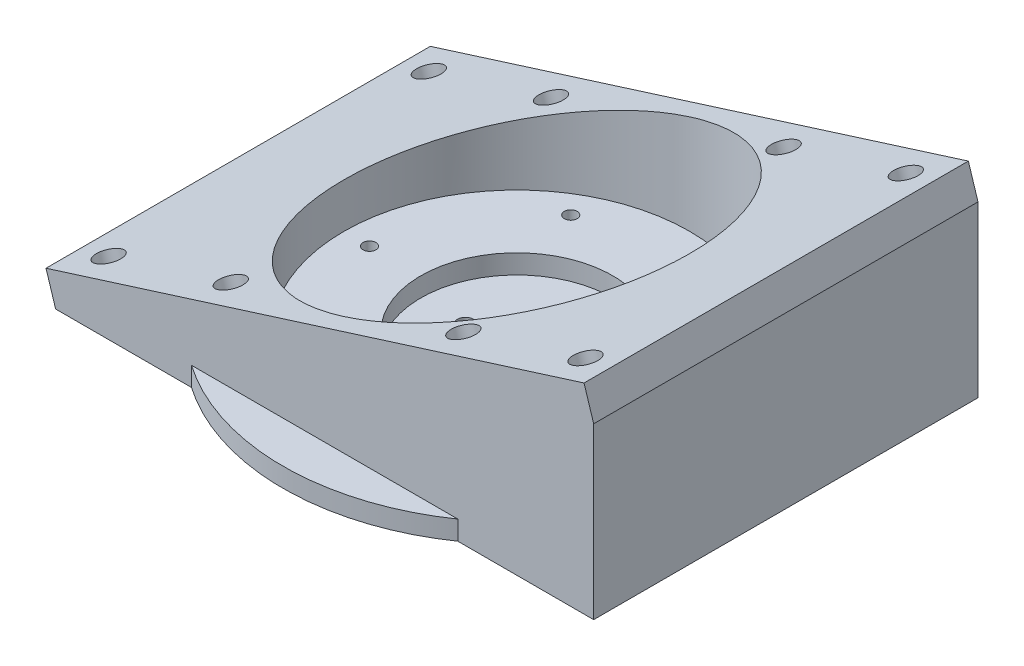
ISO-10303-21;
HEADER;
FILE_DESCRIPTION(('STEP AP214'),'2;1');
FILE_NAME('part.step','',(''),(''),'','','');
FILE_SCHEMA(('AUTOMOTIVE_DESIGN { 1 0 10303 214 1 1 1 1 }'));
ENDSEC;
DATA;
#1=APPLICATION_CONTEXT('core data for automotive mechanical design processes');
#2=APPLICATION_PROTOCOL_DEFINITION('international standard','automotive_design',2000,#1);
#3=PRODUCT_CONTEXT('',#1,'mechanical');
#4=PRODUCT('Part','Part','',(#3));
#5=PRODUCT_RELATED_PRODUCT_CATEGORY('part','',(#4));
#6=PRODUCT_DEFINITION_FORMATION('','',#4);
#7=PRODUCT_DEFINITION_CONTEXT('part definition',#1,'design');
#8=PRODUCT_DEFINITION('design','',#6,#7);
#9=PRODUCT_DEFINITION_SHAPE('','',#8);
#10=(LENGTH_UNIT() NAMED_UNIT(*) SI_UNIT(.MILLI.,.METRE.));
#11=(NAMED_UNIT(*) PLANE_ANGLE_UNIT() SI_UNIT($,.RADIAN.));
#12=(NAMED_UNIT(*) SI_UNIT($,.STERADIAN.) SOLID_ANGLE_UNIT());
#13=UNCERTAINTY_MEASURE_WITH_UNIT(LENGTH_MEASURE(1.E-05),#10,'distance_accuracy_value','');
#14=(GEOMETRIC_REPRESENTATION_CONTEXT(3) GLOBAL_UNCERTAINTY_ASSIGNED_CONTEXT((#13)) GLOBAL_UNIT_ASSIGNED_CONTEXT((#10,
#11,#12)) REPRESENTATION_CONTEXT('',''));
#15=CARTESIAN_POINT('',(0.,0.,0.));
#16=DIRECTION('',(0.,0.,1.));
#17=DIRECTION('',(1.,0.,0.));
#18=AXIS2_PLACEMENT_3D('',#15,#16,#17);
#19=CARTESIAN_POINT('',(-25.0823798627002,-10.9576659038902,30.));
#20=DIRECTION('',(0.,1.,0.));
#21=DIRECTION('',(0.,0.,1.));
#22=AXIS2_PLACEMENT_3D('',#19,#20,#21);
#23=CYLINDRICAL_SURFACE('',#22,6.);
#24=CARTESIAN_POINT('',(-25.0823798627002,-10.9576659038902,30.));
#25=DIRECTION('',(0.,1.,0.));
#26=DIRECTION('',(0.,0.,1.));
#27=AXIS2_PLACEMENT_3D('',#24,#25,#26);
#28=CIRCLE('',#27,6.);
#29=CARTESIAN_POINT('',(-25.0823798627002,-10.9576659038902,36.));
#30=VERTEX_POINT('',#29);
#31=EDGE_CURVE('E423',#30,#30,#28,.T.);
#32=ORIENTED_EDGE('',*,*,#31,.F.);
#33=EDGE_LOOP('',(#32));
#34=FACE_BOUND('',#33,.T.);
#35=CARTESIAN_POINT('',(-25.0823798627002,-7.95766590389017,30.));
#36=DIRECTION('',(0.,1.,0.));
#37=DIRECTION('',(0.,0.,1.));
#38=AXIS2_PLACEMENT_3D('',#35,#36,#37);
#39=CIRCLE('',#38,6.);
#40=CARTESIAN_POINT('',(-25.0823798627002,-7.95766590389017,36.));
#41=VERTEX_POINT('',#40);
#42=EDGE_CURVE('E54',#41,#41,#39,.F.);
#43=ORIENTED_EDGE('',*,*,#42,.F.);
#44=EDGE_LOOP('',(#43));
#45=FACE_BOUND('',#44,.T.);
#46=ADVANCED_FACE('F50',(#34,#45),#23,.F.);
#47=CARTESIAN_POINT('',(-25.0823798627002,42.0423340961098,30.));
#48=DIRECTION('',(0.,-1.,0.));
#49=DIRECTION('',(0.,0.,-1.));
#50=AXIS2_PLACEMENT_3D('',#47,#48,#49);
#51=CYLINDRICAL_SURFACE('',#50,27.);
#52=CARTESIAN_POINT('',(-25.0823798627002,10.5275288547312,30.));
#53=DIRECTION('',(-0.300705799504274,0.953716950748227,0.));
#54=DIRECTION('',(-0.953716950748227,-0.300705799504274,0.));
#55=AXIS2_PLACEMENT_3D('',#52,#53,#54);
#56=ELLIPSE('',#55,28.3102863788019,27.);
#57=CARTESIAN_POINT('',(-52.0823798627002,2.01446155499865,30.));
#58=VERTEX_POINT('',#57);
#59=EDGE_CURVE('E151',#58,#58,#56,.T.);
#60=ORIENTED_EDGE('',*,*,#59,.T.);
#61=EDGE_LOOP('',(#60));
#62=FACE_BOUND('',#61,.T.);
#63=CARTESIAN_POINT('',(-25.0823798627002,-4.95766590389017,30.));
#64=DIRECTION('',(0.,-1.,0.));
#65=DIRECTION('',(0.,0.,-1.));
#66=AXIS2_PLACEMENT_3D('',#63,#64,#65);
#67=CIRCLE('',#66,27.);
#68=CARTESIAN_POINT('',(-25.0823798627002,-4.95766590389017,3.));
#69=VERTEX_POINT('',#68);
#70=EDGE_CURVE('E185',#69,#69,#67,.F.);
#71=ORIENTED_EDGE('',*,*,#70,.F.);
#72=EDGE_LOOP('',(#71));
#73=FACE_BOUND('',#72,.T.);
#74=ADVANCED_FACE('F219',(#62,#73),#51,.F.);
#75=CARTESIAN_POINT('',(-67.0823798627002,-7.95766590389017,60.));
#76=DIRECTION('',(0.,1.,0.));
#77=DIRECTION('',(0.,0.,1.));
#78=AXIS2_PLACEMENT_3D('',#75,#76,#77);
#79=PLANE('',#78);
#80=CARTESIAN_POINT('',(-36.5823798627005,-7.95766590389017,10.081415712958));
#81=DIRECTION('',(0.,1.,0.));
#82=DIRECTION('',(0.,0.,1.));
#83=AXIS2_PLACEMENT_3D('',#80,#81,#82);
#84=CIRCLE('',#83,0.999999999999998);
#85=CARTESIAN_POINT('',(-36.5823798627005,-7.95766590389017,11.081415712958));
#86=VERTEX_POINT('',#85);
#87=EDGE_CURVE('E337',#86,#86,#84,.T.);
#88=ORIENTED_EDGE('',*,*,#87,.T.);
#89=EDGE_LOOP('',(#88));
#90=FACE_BOUND('',#89,.T.);
#91=CARTESIAN_POINT('',(-13.5823798627004,-7.95766590389017,10.0814157129578));
#92=DIRECTION('',(0.,1.,0.));
#93=DIRECTION('',(0.,0.,1.));
#94=AXIS2_PLACEMENT_3D('',#91,#92,#93);
#95=CIRCLE('',#94,0.999999999999998);
#96=CARTESIAN_POINT('',(-13.5823798627004,-7.95766590389017,11.0814157129578));
#97=VERTEX_POINT('',#96);
#98=EDGE_CURVE('E342',#97,#97,#95,.T.);
#99=ORIENTED_EDGE('',*,*,#98,.T.);
#100=EDGE_LOOP('',(#99));
#101=FACE_BOUND('',#100,.T.);
#102=CARTESIAN_POINT('',(-2.08237986270024,-7.95766590389017,30.));
#103=DIRECTION('',(0.,1.,0.));
#104=DIRECTION('',(0.,0.,1.));
#105=AXIS2_PLACEMENT_3D('',#102,#103,#104);
#106=CIRCLE('',#105,0.999999999999998);
#107=CARTESIAN_POINT('',(-2.08237986270024,-7.95766590389017,31.));
#108=VERTEX_POINT('',#107);
#109=EDGE_CURVE('E345',#108,#108,#106,.T.);
#110=ORIENTED_EDGE('',*,*,#109,.T.);
#111=EDGE_LOOP('',(#110));
#112=FACE_BOUND('',#111,.T.);
#113=CARTESIAN_POINT('',(-13.5823798627001,-7.95766590389017,49.918584287042));
#114=DIRECTION('',(0.,1.,0.));
#115=DIRECTION('',(0.,0.,1.));
#116=AXIS2_PLACEMENT_3D('',#113,#114,#115);
#117=CIRCLE('',#116,0.999999999999998);
#118=CARTESIAN_POINT('',(-13.5823798627001,-7.95766590389017,50.918584287042));
#119=VERTEX_POINT('',#118);
#120=EDGE_CURVE('E348',#119,#119,#117,.T.);
#121=ORIENTED_EDGE('',*,*,#120,.T.);
#122=EDGE_LOOP('',(#121));
#123=FACE_BOUND('',#122,.T.);
#124=CARTESIAN_POINT('',(-36.5823798627002,-7.95766590389017,49.9185842870421));
#125=DIRECTION('',(0.,1.,0.));
#126=DIRECTION('',(0.,0.,1.));
#127=AXIS2_PLACEMENT_3D('',#124,#125,#126);
#128=CIRCLE('',#127,0.999999999999998);
#129=CARTESIAN_POINT('',(-36.5823798627002,-7.95766590389017,50.9185842870421));
#130=VERTEX_POINT('',#129);
#131=EDGE_CURVE('E351',#130,#130,#128,.T.);
#132=ORIENTED_EDGE('',*,*,#131,.T.);
#133=EDGE_LOOP('',(#132));
#134=FACE_BOUND('',#133,.T.);
#135=CARTESIAN_POINT('',(-48.0823798627002,-7.95766590389017,30.));
#136=DIRECTION('',(0.,1.,0.));
#137=DIRECTION('',(0.,0.,1.));
#138=AXIS2_PLACEMENT_3D('',#135,#136,#137);
#139=CIRCLE('',#138,0.999999999999998);
#140=CARTESIAN_POINT('',(-48.0823798627002,-7.95766590389017,31.));
#141=VERTEX_POINT('',#140);
#142=EDGE_CURVE('E144',#141,#141,#139,.T.);
#143=ORIENTED_EDGE('',*,*,#142,.T.);
#144=EDGE_LOOP('',(#143));
#145=FACE_BOUND('',#144,.T.);
#146=CARTESIAN_POINT('',(-25.0823798627002,-7.95766590389017,30.));
#147=DIRECTION('',(0.,1.,0.));
#148=DIRECTION('',(0.,0.,1.));
#149=AXIS2_PLACEMENT_3D('',#146,#147,#148);
#150=CIRCLE('',#149,20.);
#151=CARTESIAN_POINT('',(-25.0823798627002,-7.95766590389017,50.));
#152=VERTEX_POINT('',#151);
#153=EDGE_CURVE('E410',#152,#152,#150,.T.);
#154=ORIENTED_EDGE('',*,*,#153,.T.);
#155=EDGE_LOOP('',(#154));
#156=FACE_BOUND('',#155,.T.);
#157=DIRECTION('',(1.,0.,0.));
#158=VECTOR('',#157,1.);
#159=CARTESIAN_POINT('',(-67.0823798627002,-7.95766590389017,0.));
#160=LINE('',#159,#158);
#161=CARTESIAN_POINT('',(-67.0823798627002,-7.95766590389017,0.));
#162=VERTEX_POINT('',#161);
#163=CARTESIAN_POINT('',(-45.873002748992,-7.95766590389017,0.));
#164=VERTEX_POINT('',#163);
#165=EDGE_CURVE('E177',#162,#164,#160,.T.);
#166=ORIENTED_EDGE('',*,*,#165,.T.);
#167=CARTESIAN_POINT('',(-25.0823798627002,-7.95766590389017,30.));
#168=DIRECTION('',(0.,-1.,0.));
#169=DIRECTION('',(0.,0.,-1.));
#170=AXIS2_PLACEMENT_3D('',#167,#168,#169);
#171=CIRCLE('',#170,36.5);
#172=CARTESIAN_POINT('',(-4.29175697640848,-7.95766590389017,0.));
#173=VERTEX_POINT('',#172);
#174=EDGE_CURVE('E139',#164,#173,#171,.T.);
#175=ORIENTED_EDGE('',*,*,#174,.T.);
#176=CARTESIAN_POINT('',(16.9176201372998,-7.95766590389017,0.));
#177=VERTEX_POINT('',#176);
#178=EDGE_CURVE('E172',#173,#177,#160,.T.);
#179=ORIENTED_EDGE('',*,*,#178,.T.);
#180=DIRECTION('',(0.,0.,-1.));
#181=VECTOR('',#180,1.);
#182=CARTESIAN_POINT('',(16.9176201372998,-7.95766590389017,60.));
#183=LINE('',#182,#181);
#184=CARTESIAN_POINT('',(16.9176201372998,-7.95766590389017,60.));
#185=VERTEX_POINT('',#184);
#186=EDGE_CURVE('E126',#185,#177,#183,.T.);
#187=ORIENTED_EDGE('',*,*,#186,.F.);
#188=DIRECTION('',(1.,0.,0.));
#189=VECTOR('',#188,1.);
#190=CARTESIAN_POINT('',(-67.0823798627002,-7.95766590389017,60.));
#191=LINE('',#190,#189);
#192=CARTESIAN_POINT('',(-4.29175697640845,-7.95766590389017,60.));
#193=VERTEX_POINT('',#192);
#194=EDGE_CURVE('E121',#193,#185,#191,.T.);
#195=ORIENTED_EDGE('',*,*,#194,.F.);
#196=CARTESIAN_POINT('',(-45.873002748992,-7.95766590389017,60.));
#197=VERTEX_POINT('',#196);
#198=EDGE_CURVE('E124',#193,#197,#171,.T.);
#199=ORIENTED_EDGE('',*,*,#198,.T.);
#200=CARTESIAN_POINT('',(-67.0823798627002,-7.95766590389017,60.));
#201=VERTEX_POINT('',#200);
#202=EDGE_CURVE('E128',#201,#197,#191,.T.);
#203=ORIENTED_EDGE('',*,*,#202,.F.);
#204=DIRECTION('',(0.,0.,-1.));
#205=VECTOR('',#204,1.);
#206=CARTESIAN_POINT('',(-67.0823798627002,-7.95766590389017,60.));
#207=LINE('',#206,#205);
#208=EDGE_CURVE('E183',#201,#162,#207,.T.);
#209=ORIENTED_EDGE('',*,*,#208,.T.);
#210=EDGE_LOOP('',(#166,#175,#179,#187,#195,#199,#203,#209));
#211=FACE_BOUND('',#210,.T.);
#212=ADVANCED_FACE('F52',(#90,#101,#112,#123,#134,#145,#156,#211),#79,.F.);
#213=CARTESIAN_POINT('',(16.9176201372998,-7.95766590389017,60.));
#214=DIRECTION('',(-1.,0.,0.));
#215=DIRECTION('',(0.,0.,1.));
#216=AXIS2_PLACEMENT_3D('',#213,#214,#215);
#217=PLANE('',#216);
#218=DIRECTION('',(0.,1.,0.));
#219=VECTOR('',#218,1.);
#220=CARTESIAN_POINT('',(16.9176201372998,-7.95766590389017,0.));
#221=LINE('',#220,#219);
#222=CARTESIAN_POINT('',(16.9176201372998,18.5274323619445,0.));
#223=VERTEX_POINT('',#222);
#224=EDGE_CURVE('E129',#177,#223,#221,.T.);
#225=ORIENTED_EDGE('',*,*,#224,.T.);
#226=DIRECTION('',(0.,0.,-1.));
#227=VECTOR('',#226,1.);
#228=CARTESIAN_POINT('',(16.9176201372998,18.5274323619445,60.));
#229=LINE('',#228,#227);
#230=CARTESIAN_POINT('',(16.9176201372998,18.5274323619445,60.));
#231=VERTEX_POINT('',#230);
#232=EDGE_CURVE('E176',#231,#223,#229,.T.);
#233=ORIENTED_EDGE('',*,*,#232,.F.);
#234=DIRECTION('',(0.,1.,0.));
#235=VECTOR('',#234,1.);
#236=CARTESIAN_POINT('',(16.9176201372998,-7.95766590389017,60.));
#237=LINE('',#236,#235);
#238=EDGE_CURVE('E174',#185,#231,#237,.T.);
#239=ORIENTED_EDGE('',*,*,#238,.F.);
#240=ORIENTED_EDGE('',*,*,#186,.T.);
#241=EDGE_LOOP('',(#225,#233,#239,#240));
#242=FACE_BOUND('',#241,.T.);
#243=ADVANCED_FACE('F499',(#242),#217,.F.);
#244=CARTESIAN_POINT('',(0.,0.,60.));
#245=DIRECTION('',(0.,0.,1.));
#246=DIRECTION('',(1.,0.,0.));
#247=AXIS2_PLACEMENT_3D('',#244,#245,#246);
#248=PLANE('',#247);
#249=DIRECTION('',(0.,-1.,0.));
#250=VECTOR('',#249,1.);
#251=CARTESIAN_POINT('',(-45.873002748992,-4.95766590389017,60.));
#252=LINE('',#251,#250);
#253=CARTESIAN_POINT('',(-45.873002748992,-4.95766590389017,60.));
#254=VERTEX_POINT('',#253);
#255=EDGE_CURVE('E71',#254,#197,#252,.T.);
#256=ORIENTED_EDGE('',*,*,#255,.F.);
#257=DIRECTION('',(1.,0.,0.));
#258=VECTOR('',#257,1.);
#259=CARTESIAN_POINT('',(0.,-4.95766590389017,60.));
#260=LINE('',#259,#258);
#261=CARTESIAN_POINT('',(-4.29175697640845,-4.95766590389017,60.));
#262=VERTEX_POINT('',#261);
#263=EDGE_CURVE('E66',#254,#262,#260,.T.);
#264=ORIENTED_EDGE('',*,*,#263,.T.);
#265=DIRECTION('',(0.,-1.,0.));
#266=VECTOR('',#265,1.);
#267=CARTESIAN_POINT('',(-4.29175697640845,-4.95766590389017,60.));
#268=LINE('',#267,#266);
#269=EDGE_CURVE('E131',#193,#262,#268,.F.);
#270=ORIENTED_EDGE('',*,*,#269,.F.);
#271=ORIENTED_EDGE('',*,*,#194,.T.);
#272=ORIENTED_EDGE('',*,*,#238,.T.);
#273=DIRECTION('',(0.300705799504274,-0.953716950748227,0.));
#274=VECTOR('',#273,1.);
#275=CARTESIAN_POINT('',(15.4140911397784,23.2960171156857,60.));
#276=LINE('',#275,#274);
#277=CARTESIAN_POINT('',(15.4140911397784,23.2960171156857,60.));
#278=VERTEX_POINT('',#277);
#279=EDGE_CURVE('E167',#278,#231,#276,.T.);
#280=ORIENTED_EDGE('',*,*,#279,.F.);
#281=DIRECTION('',(0.953716950748227,0.300705799504274,0.));
#282=VECTOR('',#281,1.);
#283=CARTESIAN_POINT('',(-68.5859088602216,-3.18908115014903,60.));
#284=LINE('',#283,#282);
#285=CARTESIAN_POINT('',(-68.5859088602216,-3.18908115014903,60.));
#286=VERTEX_POINT('',#285);
#287=EDGE_CURVE('E155',#286,#278,#284,.T.);
#288=ORIENTED_EDGE('',*,*,#287,.F.);
#289=DIRECTION('',(0.300705799504274,-0.953716950748227,0.));
#290=VECTOR('',#289,1.);
#291=CARTESIAN_POINT('',(-68.5859088602216,-3.18908115014903,60.));
#292=LINE('',#291,#290);
#293=EDGE_CURVE('E170',#286,#201,#292,.T.);
#294=ORIENTED_EDGE('',*,*,#293,.T.);
#295=ORIENTED_EDGE('',*,*,#202,.T.);
#296=EDGE_LOOP('',(#256,#264,#270,#271,#272,#280,#288,#294,#295));
#297=FACE_BOUND('',#296,.T.);
#298=ADVANCED_FACE('F132',(#297),#248,.T.);
#299=CARTESIAN_POINT('',(0.,0.,0.));
#300=DIRECTION('',(0.,0.,1.));
#301=DIRECTION('',(1.,0.,0.));
#302=AXIS2_PLACEMENT_3D('',#299,#300,#301);
#303=PLANE('',#302);
#304=DIRECTION('',(1.,0.,0.));
#305=VECTOR('',#304,1.);
#306=CARTESIAN_POINT('',(0.,-4.95766590389017,0.));
#307=LINE('',#306,#305);
#308=CARTESIAN_POINT('',(-45.873002748992,-4.95766590389017,0.));
#309=VERTEX_POINT('',#308);
#310=CARTESIAN_POINT('',(-4.29175697640845,-4.95766590389017,0.));
#311=VERTEX_POINT('',#310);
#312=EDGE_CURVE('E147',#309,#311,#307,.T.);
#313=ORIENTED_EDGE('',*,*,#312,.F.);
#314=DIRECTION('',(0.,-1.,0.));
#315=VECTOR('',#314,1.);
#316=CARTESIAN_POINT('',(-45.873002748992,-4.95766590389017,0.));
#317=LINE('',#316,#315);
#318=EDGE_CURVE('E13',#309,#164,#317,.T.);
#319=ORIENTED_EDGE('',*,*,#318,.T.);
#320=ORIENTED_EDGE('',*,*,#165,.F.);
#321=DIRECTION('',(0.300705799504274,-0.953716950748227,0.));
#322=VECTOR('',#321,1.);
#323=CARTESIAN_POINT('',(-68.5859088602216,-3.18908115014903,0.));
#324=LINE('',#323,#322);
#325=CARTESIAN_POINT('',(-68.5859088602216,-3.18908115014903,0.));
#326=VERTEX_POINT('',#325);
#327=EDGE_CURVE('E161',#326,#162,#324,.T.);
#328=ORIENTED_EDGE('',*,*,#327,.F.);
#329=DIRECTION('',(-0.953716950748227,-0.300705799504274,0.));
#330=VECTOR('',#329,1.);
#331=CARTESIAN_POINT('',(-68.5859088602216,-3.18908115014903,0.));
#332=LINE('',#331,#330);
#333=CARTESIAN_POINT('',(15.4140911397784,23.2960171156856,0.));
#334=VERTEX_POINT('',#333);
#335=EDGE_CURVE('E159',#334,#326,#332,.T.);
#336=ORIENTED_EDGE('',*,*,#335,.F.);
#337=DIRECTION('',(0.300705799504274,-0.953716950748227,0.));
#338=VECTOR('',#337,1.);
#339=CARTESIAN_POINT('',(15.4140911397784,23.2960171156856,0.));
#340=LINE('',#339,#338);
#341=EDGE_CURVE('E164',#334,#223,#340,.T.);
#342=ORIENTED_EDGE('',*,*,#341,.T.);
#343=ORIENTED_EDGE('',*,*,#224,.F.);
#344=ORIENTED_EDGE('',*,*,#178,.F.);
#345=DIRECTION('',(0.,-1.,0.));
#346=VECTOR('',#345,1.);
#347=CARTESIAN_POINT('',(-4.29175697640845,-4.95766590389017,0.));
#348=LINE('',#347,#346);
#349=EDGE_CURVE('E59',#173,#311,#348,.F.);
#350=ORIENTED_EDGE('',*,*,#349,.T.);
#351=EDGE_LOOP('',(#313,#319,#320,#328,#336,#342,#343,#344,#350));
#352=FACE_BOUND('',#351,.T.);
#353=ADVANCED_FACE('F195',(#352),#303,.F.);
#354=CARTESIAN_POINT('',(-68.5859088602216,-3.18908115014903,0.));
#355=DIRECTION('',(0.953716950748227,0.300705799504274,0.));
#356=DIRECTION('',(-0.300705799504274,0.953716950748227,0.));
#357=AXIS2_PLACEMENT_3D('',#354,#355,#356);
#358=PLANE('',#357);
#359=ORIENTED_EDGE('',*,*,#208,.F.);
#360=ORIENTED_EDGE('',*,*,#293,.F.);
#361=DIRECTION('',(0.,0.,1.));
#362=VECTOR('',#361,1.);
#363=CARTESIAN_POINT('',(-68.5859088602216,-3.18908115014903,0.));
#364=LINE('',#363,#362);
#365=EDGE_CURVE('E152',#326,#286,#364,.T.);
#366=ORIENTED_EDGE('',*,*,#365,.F.);
#367=ORIENTED_EDGE('',*,*,#327,.T.);
#368=EDGE_LOOP('',(#359,#360,#366,#367));
#369=FACE_BOUND('',#368,.T.);
#370=ADVANCED_FACE('F525',(#369),#358,.F.);
#371=CARTESIAN_POINT('',(15.4140911397784,23.2960171156856,0.));
#372=DIRECTION('',(-0.953716950748227,-0.300705799504274,0.));
#373=DIRECTION('',(0.300705799504274,-0.953716950748227,0.));
#374=AXIS2_PLACEMENT_3D('',#371,#372,#373);
#375=PLANE('',#374);
#376=ORIENTED_EDGE('',*,*,#232,.T.);
#377=ORIENTED_EDGE('',*,*,#341,.F.);
#378=DIRECTION('',(0.,0.,-1.));
#379=VECTOR('',#378,1.);
#380=CARTESIAN_POINT('',(15.4140911397784,23.2960171156856,0.));
#381=LINE('',#380,#379);
#382=EDGE_CURVE('E157',#278,#334,#381,.T.);
#383=ORIENTED_EDGE('',*,*,#382,.F.);
#384=ORIENTED_EDGE('',*,*,#279,.T.);
#385=EDGE_LOOP('',(#376,#377,#383,#384));
#386=FACE_BOUND('',#385,.T.);
#387=ADVANCED_FACE('F528',(#386),#375,.F.);
#388=CARTESIAN_POINT('',(-5.28721980330794,16.7689188471233,0.));
#389=DIRECTION('',(-0.300705799504274,0.953716950748227,0.));
#390=DIRECTION('',(-0.953716950748227,-0.300705799504274,0.));
#391=AXIS2_PLACEMENT_3D('',#388,#389,#390);
#392=PLANE('',#391);
#393=CARTESIAN_POINT('',(-8.42883262892728,15.7783721280788,55.));
#394=DIRECTION('',(-0.300705799504274,0.953716950748227,0.));
#395=DIRECTION('',(-0.953716950748227,-0.300705799504274,0.));
#396=AXIS2_PLACEMENT_3D('',#393,#394,#395);
#397=CIRCLE('',#396,2.);
#398=CARTESIAN_POINT('',(-10.3362665304237,15.1769605290703,55.));
#399=VERTEX_POINT('',#398);
#400=EDGE_CURVE('E413',#399,#399,#397,.T.);
#401=ORIENTED_EDGE('',*,*,#400,.F.);
#402=EDGE_LOOP('',(#401));
#403=FACE_BOUND('',#402,.T.);
#404=CARTESIAN_POINT('',(-8.42883262892728,15.7783721280788,5.));
#405=DIRECTION('',(-0.300705799504274,0.953716950748227,0.));
#406=DIRECTION('',(-0.953716950748227,-0.300705799504274,0.));
#407=AXIS2_PLACEMENT_3D('',#404,#405,#406);
#408=CIRCLE('',#407,2.);
#409=CARTESIAN_POINT('',(-10.3362665304237,15.1769605290703,5.));
#410=VERTEX_POINT('',#409);
#411=EDGE_CURVE('E406',#410,#410,#408,.T.);
#412=ORIENTED_EDGE('',*,*,#411,.F.);
#413=EDGE_LOOP('',(#412));
#414=FACE_BOUND('',#413,.T.);
#415=CARTESIAN_POINT('',(10.6455063860373,21.7924881181643,55.));
#416=DIRECTION('',(-0.300705799504274,0.953716950748227,0.));
#417=DIRECTION('',(-0.953716950748227,-0.300705799504274,0.));
#418=AXIS2_PLACEMENT_3D('',#415,#416,#417);
#419=CIRCLE('',#418,2.);
#420=CARTESIAN_POINT('',(8.7380724845408,21.1910765191557,55.));
#421=VERTEX_POINT('',#420);
#422=EDGE_CURVE('E401',#421,#421,#419,.T.);
#423=ORIENTED_EDGE('',*,*,#422,.F.);
#424=EDGE_LOOP('',(#423));
#425=FACE_BOUND('',#424,.T.);
#426=CARTESIAN_POINT('',(10.6455063860373,21.7924881181643,5.));
#427=DIRECTION('',(-0.300705799504274,0.953716950748227,0.));
#428=DIRECTION('',(-0.953716950748227,-0.300705799504274,0.));
#429=AXIS2_PLACEMENT_3D('',#426,#427,#428);
#430=CIRCLE('',#429,2.);
#431=CARTESIAN_POINT('',(8.7380724845408,21.1910765191557,5.));
#432=VERTEX_POINT('',#431);
#433=EDGE_CURVE('E397',#432,#432,#430,.T.);
#434=ORIENTED_EDGE('',*,*,#433,.F.);
#435=EDGE_LOOP('',(#434));
#436=FACE_BOUND('',#435,.T.);
#437=CARTESIAN_POINT('',(-44.742985091516,4.32856383745781,5.));
#438=DIRECTION('',(-0.300705799504274,0.953716950748227,0.));
#439=DIRECTION('',(-0.953716950748227,-0.300705799504274,0.));
#440=AXIS2_PLACEMENT_3D('',#437,#438,#439);
#441=CIRCLE('',#440,2.00000000000001);
#442=CARTESIAN_POINT('',(-46.6504189930124,3.72715223844926,5.));
#443=VERTEX_POINT('',#442);
#444=EDGE_CURVE('E389',#443,#443,#441,.T.);
#445=ORIENTED_EDGE('',*,*,#444,.F.);
#446=EDGE_LOOP('',(#445));
#447=FACE_BOUND('',#446,.T.);
#448=CARTESIAN_POINT('',(-44.742985091516,4.32856383745781,55.));
#449=DIRECTION('',(-0.300705799504274,0.953716950748227,0.));
#450=DIRECTION('',(-0.953716950748227,-0.300705799504274,0.));
#451=AXIS2_PLACEMENT_3D('',#448,#449,#450);
#452=CIRCLE('',#451,2.00000000000001);
#453=CARTESIAN_POINT('',(-46.6504189930124,3.72715223844926,55.));
#454=VERTEX_POINT('',#453);
#455=EDGE_CURVE('E382',#454,#454,#452,.T.);
#456=ORIENTED_EDGE('',*,*,#455,.F.);
#457=EDGE_LOOP('',(#456));
#458=FACE_BOUND('',#457,.T.);
#459=CARTESIAN_POINT('',(-63.8173241064805,-1.68555215262767,5.));
#460=DIRECTION('',(-0.300705799504274,0.953716950748227,0.));
#461=DIRECTION('',(-0.953716950748227,-0.300705799504274,0.));
#462=AXIS2_PLACEMENT_3D('',#459,#460,#461);
#463=CIRCLE('',#462,2.00000000000001);
#464=CARTESIAN_POINT('',(-65.724758007977,-2.28696375163622,5.));
#465=VERTEX_POINT('',#464);
#466=EDGE_CURVE('E377',#465,#465,#463,.T.);
#467=ORIENTED_EDGE('',*,*,#466,.F.);
#468=EDGE_LOOP('',(#467));
#469=FACE_BOUND('',#468,.T.);
#470=CARTESIAN_POINT('',(-63.8173241064805,-1.68555215262767,55.));
#471=DIRECTION('',(-0.300705799504274,0.953716950748227,0.));
#472=DIRECTION('',(-0.953716950748227,-0.300705799504274,0.));
#473=AXIS2_PLACEMENT_3D('',#470,#471,#472);
#474=CIRCLE('',#473,2.00000000000001);
#475=CARTESIAN_POINT('',(-65.724758007977,-2.28696375163622,55.));
#476=VERTEX_POINT('',#475);
#477=EDGE_CURVE('E373',#476,#476,#474,.T.);
#478=ORIENTED_EDGE('',*,*,#477,.F.);
#479=EDGE_LOOP('',(#478));
#480=FACE_BOUND('',#479,.T.);
#481=ORIENTED_EDGE('',*,*,#59,.F.);
#482=EDGE_LOOP('',(#481));
#483=FACE_BOUND('',#482,.T.);
#484=ORIENTED_EDGE('',*,*,#365,.T.);
#485=ORIENTED_EDGE('',*,*,#287,.T.);
#486=ORIENTED_EDGE('',*,*,#382,.T.);
#487=ORIENTED_EDGE('',*,*,#335,.T.);
#488=EDGE_LOOP('',(#484,#485,#486,#487));
#489=FACE_BOUND('',#488,.T.);
#490=ADVANCED_FACE('F212',(#403,#414,#425,#436,#447,#458,#469,#480,#483,#489),#392,.T.);
#491=CARTESIAN_POINT('',(-25.0823798627002,-4.95766590389017,30.));
#492=DIRECTION('',(0.,-1.,0.));
#493=DIRECTION('',(0.,0.,-1.));
#494=AXIS2_PLACEMENT_3D('',#491,#492,#493);
#495=PLANE('',#494);
#496=CARTESIAN_POINT('',(-25.0823798627002,-4.95766590389017,30.));
#497=DIRECTION('',(0.,1.,0.));
#498=DIRECTION('',(0.,0.,1.));
#499=AXIS2_PLACEMENT_3D('',#496,#497,#498);
#500=CIRCLE('',#499,15.);
#501=CARTESIAN_POINT('',(-25.0823798627002,-4.95766590389017,45.));
#502=VERTEX_POINT('',#501);
#503=EDGE_CURVE('E426',#502,#502,#500,.T.);
#504=ORIENTED_EDGE('',*,*,#503,.F.);
#505=EDGE_LOOP('',(#504));
#506=FACE_BOUND('',#505,.T.);
#507=CARTESIAN_POINT('',(-36.5823798627005,-4.95766590389017,10.081415712958));
#508=DIRECTION('',(0.,1.,0.));
#509=DIRECTION('',(-0.866025403784433,0.,0.50000000000001));
#510=AXIS2_PLACEMENT_3D('',#507,#508,#509);
#511=CIRCLE('',#510,0.999999999999998);
#512=CARTESIAN_POINT('',(-37.4484052664849,-4.95766590389017,10.5814157129581));
#513=VERTEX_POINT('',#512);
#514=EDGE_CURVE('E358',#513,#513,#511,.T.);
#515=ORIENTED_EDGE('',*,*,#514,.F.);
#516=EDGE_LOOP('',(#515));
#517=FACE_BOUND('',#516,.T.);
#518=CARTESIAN_POINT('',(-13.5823798627004,-4.95766590389017,10.0814157129578));
#519=DIRECTION('',(0.,1.,0.));
#520=DIRECTION('',(-0.866025403784443,0.,-0.499999999999992));
#521=AXIS2_PLACEMENT_3D('',#518,#519,#520);
#522=CIRCLE('',#521,0.999999999999998);
#523=CARTESIAN_POINT('',(-14.4484052664849,-4.95766590389017,9.58141571295782));
#524=VERTEX_POINT('',#523);
#525=EDGE_CURVE('E361',#524,#524,#522,.T.);
#526=ORIENTED_EDGE('',*,*,#525,.F.);
#527=EDGE_LOOP('',(#526));
#528=FACE_BOUND('',#527,.T.);
#529=CARTESIAN_POINT('',(-2.08237986270024,-4.95766590389017,30.));
#530=DIRECTION('',(0.,1.,0.));
#531=DIRECTION('',(0.,0.,-1.));
#532=AXIS2_PLACEMENT_3D('',#529,#530,#531);
#533=CIRCLE('',#532,0.999999999999998);
#534=CARTESIAN_POINT('',(-2.08237986270024,-4.95766590389017,29.));
#535=VERTEX_POINT('',#534);
#536=EDGE_CURVE('E365',#535,#535,#533,.T.);
#537=ORIENTED_EDGE('',*,*,#536,.F.);
#538=EDGE_LOOP('',(#537));
#539=FACE_BOUND('',#538,.T.);
#540=CARTESIAN_POINT('',(-13.5823798627001,-4.95766590389017,49.918584287042));
#541=DIRECTION('',(0.,1.,0.));
#542=DIRECTION('',(0.866025403784436,0.,-0.500000000000004));
#543=AXIS2_PLACEMENT_3D('',#540,#541,#542);
#544=CIRCLE('',#543,0.999999999999998);
#545=CARTESIAN_POINT('',(-12.7163544589157,-4.95766590389017,49.418584287042));
#546=VERTEX_POINT('',#545);
#547=EDGE_CURVE('E357',#546,#546,#544,.T.);
#548=ORIENTED_EDGE('',*,*,#547,.F.);
#549=EDGE_LOOP('',(#548));
#550=FACE_BOUND('',#549,.T.);
#551=CARTESIAN_POINT('',(-36.5823798627002,-4.95766590389017,49.9185842870421));
#552=DIRECTION('',(0.,1.,0.));
#553=DIRECTION('',(0.86602540378444,0.,0.499999999999998));
#554=AXIS2_PLACEMENT_3D('',#551,#552,#553);
#555=CIRCLE('',#554,0.999999999999998);
#556=CARTESIAN_POINT('',(-35.7163544589158,-4.95766590389017,50.4185842870421));
#557=VERTEX_POINT('',#556);
#558=EDGE_CURVE('E354',#557,#557,#555,.T.);
#559=ORIENTED_EDGE('',*,*,#558,.F.);
#560=EDGE_LOOP('',(#559));
#561=FACE_BOUND('',#560,.T.);
#562=CARTESIAN_POINT('',(-48.0823798627002,-4.95766590389017,30.));
#563=DIRECTION('',(0.,1.,0.));
#564=DIRECTION('',(0.,0.,1.));
#565=AXIS2_PLACEMENT_3D('',#562,#563,#564);
#566=CIRCLE('',#565,0.999999999999998);
#567=CARTESIAN_POINT('',(-48.0823798627002,-4.95766590389017,31.));
#568=VERTEX_POINT('',#567);
#569=EDGE_CURVE('E333',#568,#568,#566,.T.);
#570=ORIENTED_EDGE('',*,*,#569,.F.);
#571=EDGE_LOOP('',(#570));
#572=FACE_BOUND('',#571,.T.);
#573=ORIENTED_EDGE('',*,*,#70,.T.);
#574=EDGE_LOOP('',(#573));
#575=FACE_BOUND('',#574,.T.);
#576=ADVANCED_FACE('F203',(#506,#517,#528,#539,#550,#561,#572,#575),#495,.F.);
#577=CARTESIAN_POINT('',(-25.0823798627002,-4.95766590389017,30.));
#578=DIRECTION('',(0.,-1.,0.));
#579=DIRECTION('',(0.,0.,-1.));
#580=AXIS2_PLACEMENT_3D('',#577,#578,#579);
#581=CIRCLE('',#580,36.5);
#582=EDGE_CURVE('E138',#309,#311,#581,.T.);
#583=ORIENTED_EDGE('',*,*,#582,.F.);
#584=ORIENTED_EDGE('',*,*,#312,.T.);
#585=EDGE_LOOP('',(#583,#584));
#586=FACE_BOUND('',#585,.T.);
#587=ADVANCED_FACE('F201',(#586),#495,.F.);
#588=CARTESIAN_POINT('',(-25.0823798627002,-4.95766590389017,30.));
#589=DIRECTION('',(0.,-1.,0.));
#590=DIRECTION('',(0.,0.,-1.));
#591=AXIS2_PLACEMENT_3D('',#588,#589,#590);
#592=CYLINDRICAL_SURFACE('',#591,36.5);
#593=ORIENTED_EDGE('',*,*,#318,.F.);
#594=ORIENTED_EDGE('',*,*,#582,.T.);
#595=ORIENTED_EDGE('',*,*,#349,.F.);
#596=ORIENTED_EDGE('',*,*,#174,.F.);
#597=EDGE_LOOP('',(#593,#594,#595,#596));
#598=FACE_BOUND('',#597,.T.);
#599=ADVANCED_FACE('F198',(#598),#592,.T.);
#600=EDGE_CURVE('E142',#262,#254,#581,.T.);
#601=ORIENTED_EDGE('',*,*,#600,.T.);
#602=ORIENTED_EDGE('',*,*,#255,.T.);
#603=ORIENTED_EDGE('',*,*,#198,.F.);
#604=ORIENTED_EDGE('',*,*,#269,.T.);
#605=EDGE_LOOP('',(#601,#602,#603,#604));
#606=FACE_BOUND('',#605,.T.);
#607=ADVANCED_FACE('F137',(#606),#592,.T.);
#608=ORIENTED_EDGE('',*,*,#263,.F.);
#609=ORIENTED_EDGE('',*,*,#600,.F.);
#610=EDGE_LOOP('',(#608,#609));
#611=FACE_BOUND('',#610,.T.);
#612=ADVANCED_FACE('F205',(#611),#495,.F.);
#613=CARTESIAN_POINT('',(-48.0823798627002,-64.9576659038902,30.));
#614=DIRECTION('',(0.,1.,0.));
#615=DIRECTION('',(0.,0.,1.));
#616=AXIS2_PLACEMENT_3D('',#613,#614,#615);
#617=CYLINDRICAL_SURFACE('',#616,0.999999999999998);
#618=ORIENTED_EDGE('',*,*,#569,.T.);
#619=EDGE_LOOP('',(#618));
#620=FACE_BOUND('',#619,.T.);
#621=ORIENTED_EDGE('',*,*,#142,.F.);
#622=EDGE_LOOP('',(#621));
#623=FACE_BOUND('',#622,.T.);
#624=ADVANCED_FACE('F216',(#620,#623),#617,.F.);
#625=CARTESIAN_POINT('',(-36.5823798627002,-64.9576659038902,49.9185842870421));
#626=DIRECTION('',(0.,1.,0.));
#627=DIRECTION('',(0.,0.,1.));
#628=AXIS2_PLACEMENT_3D('',#625,#626,#627);
#629=CYLINDRICAL_SURFACE('',#628,0.999999999999998);
#630=ORIENTED_EDGE('',*,*,#558,.T.);
#631=EDGE_LOOP('',(#630));
#632=FACE_BOUND('',#631,.T.);
#633=ORIENTED_EDGE('',*,*,#131,.F.);
#634=EDGE_LOOP('',(#633));
#635=FACE_BOUND('',#634,.T.);
#636=ADVANCED_FACE('F311',(#632,#635),#629,.F.);
#637=CARTESIAN_POINT('',(-13.5823798627001,-64.9576659038902,49.918584287042));
#638=DIRECTION('',(0.,1.,0.));
#639=DIRECTION('',(0.,0.,1.));
#640=AXIS2_PLACEMENT_3D('',#637,#638,#639);
#641=CYLINDRICAL_SURFACE('',#640,0.999999999999998);
#642=ORIENTED_EDGE('',*,*,#547,.T.);
#643=EDGE_LOOP('',(#642));
#644=FACE_BOUND('',#643,.T.);
#645=ORIENTED_EDGE('',*,*,#120,.F.);
#646=EDGE_LOOP('',(#645));
#647=FACE_BOUND('',#646,.T.);
#648=ADVANCED_FACE('F307',(#644,#647),#641,.F.);
#649=CARTESIAN_POINT('',(-2.08237986270024,-64.9576659038902,30.));
#650=DIRECTION('',(0.,1.,0.));
#651=DIRECTION('',(0.,0.,1.));
#652=AXIS2_PLACEMENT_3D('',#649,#650,#651);
#653=CYLINDRICAL_SURFACE('',#652,0.999999999999998);
#654=ORIENTED_EDGE('',*,*,#536,.T.);
#655=EDGE_LOOP('',(#654));
#656=FACE_BOUND('',#655,.T.);
#657=ORIENTED_EDGE('',*,*,#109,.F.);
#658=EDGE_LOOP('',(#657));
#659=FACE_BOUND('',#658,.T.);
#660=ADVANCED_FACE('F310',(#656,#659),#653,.F.);
#661=CARTESIAN_POINT('',(-13.5823798627004,-64.9576659038902,10.0814157129578));
#662=DIRECTION('',(0.,1.,0.));
#663=DIRECTION('',(0.,0.,1.));
#664=AXIS2_PLACEMENT_3D('',#661,#662,#663);
#665=CYLINDRICAL_SURFACE('',#664,0.999999999999998);
#666=ORIENTED_EDGE('',*,*,#525,.T.);
#667=EDGE_LOOP('',(#666));
#668=FACE_BOUND('',#667,.T.);
#669=ORIENTED_EDGE('',*,*,#98,.F.);
#670=EDGE_LOOP('',(#669));
#671=FACE_BOUND('',#670,.T.);
#672=ADVANCED_FACE('F315',(#668,#671),#665,.F.);
#673=CARTESIAN_POINT('',(-36.5823798627005,-64.9576659038902,10.081415712958));
#674=DIRECTION('',(0.,1.,0.));
#675=DIRECTION('',(0.,0.,1.));
#676=AXIS2_PLACEMENT_3D('',#673,#674,#675);
#677=CYLINDRICAL_SURFACE('',#676,0.999999999999998);
#678=ORIENTED_EDGE('',*,*,#514,.T.);
#679=EDGE_LOOP('',(#678));
#680=FACE_BOUND('',#679,.T.);
#681=ORIENTED_EDGE('',*,*,#87,.F.);
#682=EDGE_LOOP('',(#681));
#683=FACE_BOUND('',#682,.T.);
#684=ADVANCED_FACE('F302',(#680,#683),#677,.F.);
#685=CARTESIAN_POINT('',(-62.9152067079677,-4.54670300487235,55.));
#686=DIRECTION('',(-0.300705799504274,0.953716950748227,0.));
#687=DIRECTION('',(-0.953716950748227,-0.300705799504274,0.));
#688=AXIS2_PLACEMENT_3D('',#685,#686,#687);
#689=CYLINDRICAL_SURFACE('',#688,2.00000000000001);
#690=CARTESIAN_POINT('',(-62.9152067079677,-4.54670300487235,55.));
#691=DIRECTION('',(-0.300705799504274,0.953716950748227,0.));
#692=DIRECTION('',(-0.953716950748227,-0.300705799504274,0.));
#693=AXIS2_PLACEMENT_3D('',#690,#691,#692);
#694=CIRCLE('',#693,2.00000000000001);
#695=CARTESIAN_POINT('',(-64.8226406094641,-5.1481146038809,55.));
#696=VERTEX_POINT('',#695);
#697=EDGE_CURVE('E370',#696,#696,#694,.T.);
#698=ORIENTED_EDGE('',*,*,#697,.F.);
#699=EDGE_LOOP('',(#698));
#700=FACE_BOUND('',#699,.T.);
#701=ORIENTED_EDGE('',*,*,#477,.T.);
#702=EDGE_LOOP('',(#701));
#703=FACE_BOUND('',#702,.T.);
#704=ADVANCED_FACE('F299',(#700,#703),#689,.F.);
#705=CARTESIAN_POINT('',(-62.9152067079677,-4.54670300487235,55.));
#706=DIRECTION('',(-0.300705799504274,0.953716950748227,0.));
#707=DIRECTION('',(-0.953716950748227,-0.300705799504274,0.));
#708=AXIS2_PLACEMENT_3D('',#705,#706,#707);
#709=PLANE('',#708);
#710=ORIENTED_EDGE('',*,*,#697,.T.);
#711=EDGE_LOOP('',(#710));
#712=FACE_BOUND('',#711,.T.);
#713=ADVANCED_FACE('F297',(#712),#709,.T.);
#714=CARTESIAN_POINT('',(-62.9152067079677,-4.54670300487235,5.));
#715=DIRECTION('',(-0.300705799504274,0.953716950748227,0.));
#716=DIRECTION('',(-0.953716950748227,-0.300705799504274,0.));
#717=AXIS2_PLACEMENT_3D('',#714,#715,#716);
#718=CYLINDRICAL_SURFACE('',#717,2.00000000000001);
#719=CARTESIAN_POINT('',(-62.9152067079677,-4.54670300487235,5.));
#720=DIRECTION('',(-0.300705799504274,0.953716950748227,0.));
#721=DIRECTION('',(-0.953716950748227,-0.300705799504274,0.));
#722=AXIS2_PLACEMENT_3D('',#719,#720,#721);
#723=CIRCLE('',#722,2.00000000000001);
#724=CARTESIAN_POINT('',(-64.8226406094641,-5.1481146038809,5.));
#725=VERTEX_POINT('',#724);
#726=EDGE_CURVE('E362',#725,#725,#723,.T.);
#727=ORIENTED_EDGE('',*,*,#726,.F.);
#728=EDGE_LOOP('',(#727));
#729=FACE_BOUND('',#728,.T.);
#730=ORIENTED_EDGE('',*,*,#466,.T.);
#731=EDGE_LOOP('',(#730));
#732=FACE_BOUND('',#731,.T.);
#733=ADVANCED_FACE('F293',(#729,#732),#718,.F.);
#734=CARTESIAN_POINT('',(-62.9152067079677,-4.54670300487235,5.));
#735=DIRECTION('',(-0.300705799504274,0.953716950748227,0.));
#736=DIRECTION('',(-0.953716950748227,-0.300705799504274,0.));
#737=AXIS2_PLACEMENT_3D('',#734,#735,#736);
#738=PLANE('',#737);
#739=ORIENTED_EDGE('',*,*,#726,.T.);
#740=EDGE_LOOP('',(#739));
#741=FACE_BOUND('',#740,.T.);
#742=ADVANCED_FACE('F289',(#741),#738,.T.);
#743=CARTESIAN_POINT('',(-43.8408676930031,1.46741298521313,55.));
#744=DIRECTION('',(-0.300705799504274,0.953716950748227,0.));
#745=DIRECTION('',(-0.953716950748227,-0.300705799504274,0.));
#746=AXIS2_PLACEMENT_3D('',#743,#744,#745);
#747=CYLINDRICAL_SURFACE('',#746,2.00000000000001);
#748=CARTESIAN_POINT('',(-43.8408676930031,1.46741298521313,55.));
#749=DIRECTION('',(-0.300705799504274,0.953716950748227,0.));
#750=DIRECTION('',(-0.953716950748227,-0.300705799504274,0.));
#751=AXIS2_PLACEMENT_3D('',#748,#749,#750);
#752=CIRCLE('',#751,2.00000000000001);
#753=CARTESIAN_POINT('',(-45.7483015944996,0.866001386204575,55.));
#754=VERTEX_POINT('',#753);
#755=EDGE_CURVE('E385',#754,#754,#752,.T.);
#756=ORIENTED_EDGE('',*,*,#755,.F.);
#757=EDGE_LOOP('',(#756));
#758=FACE_BOUND('',#757,.T.);
#759=ORIENTED_EDGE('',*,*,#455,.T.);
#760=EDGE_LOOP('',(#759));
#761=FACE_BOUND('',#760,.T.);
#762=ADVANCED_FACE('F285',(#758,#761),#747,.F.);
#763=CARTESIAN_POINT('',(-43.8408676930031,1.46741298521313,55.));
#764=DIRECTION('',(-0.300705799504274,0.953716950748227,0.));
#765=DIRECTION('',(-0.953716950748227,-0.300705799504274,0.));
#766=AXIS2_PLACEMENT_3D('',#763,#764,#765);
#767=PLANE('',#766);
#768=ORIENTED_EDGE('',*,*,#755,.T.);
#769=EDGE_LOOP('',(#768));
#770=FACE_BOUND('',#769,.T.);
#771=ADVANCED_FACE('F281',(#770),#767,.T.);
#772=CARTESIAN_POINT('',(-43.8408676930031,1.46741298521313,5.));
#773=DIRECTION('',(-0.300705799504274,0.953716950748227,0.));
#774=DIRECTION('',(-0.953716950748227,-0.300705799504274,0.));
#775=AXIS2_PLACEMENT_3D('',#772,#773,#774);
#776=CYLINDRICAL_SURFACE('',#775,2.00000000000001);
#777=CARTESIAN_POINT('',(-43.8408676930031,1.46741298521313,5.));
#778=DIRECTION('',(-0.300705799504274,0.953716950748227,0.));
#779=DIRECTION('',(-0.953716950748227,-0.300705799504274,0.));
#780=AXIS2_PLACEMENT_3D('',#777,#778,#779);
#781=CIRCLE('',#780,2.00000000000001);
#782=CARTESIAN_POINT('',(-45.7483015944996,0.866001386204575,5.));
#783=VERTEX_POINT('',#782);
#784=EDGE_CURVE('E374',#783,#783,#781,.T.);
#785=ORIENTED_EDGE('',*,*,#784,.F.);
#786=EDGE_LOOP('',(#785));
#787=FACE_BOUND('',#786,.T.);
#788=ORIENTED_EDGE('',*,*,#444,.T.);
#789=EDGE_LOOP('',(#788));
#790=FACE_BOUND('',#789,.T.);
#791=ADVANCED_FACE('F277',(#787,#790),#776,.F.);
#792=CARTESIAN_POINT('',(-43.8408676930031,1.46741298521313,5.));
#793=DIRECTION('',(-0.300705799504274,0.953716950748227,0.));
#794=DIRECTION('',(-0.953716950748227,-0.300705799504274,0.));
#795=AXIS2_PLACEMENT_3D('',#792,#793,#794);
#796=PLANE('',#795);
#797=ORIENTED_EDGE('',*,*,#784,.T.);
#798=EDGE_LOOP('',(#797));
#799=FACE_BOUND('',#798,.T.);
#800=ADVANCED_FACE('F270',(#799),#796,.T.);
#801=CARTESIAN_POINT('',(11.5476237845501,18.9313372659196,5.));
#802=DIRECTION('',(-0.300705799504274,0.953716950748227,0.));
#803=DIRECTION('',(-0.953716950748227,-0.300705799504274,0.));
#804=AXIS2_PLACEMENT_3D('',#801,#802,#803);
#805=CYLINDRICAL_SURFACE('',#804,2.);
#806=CARTESIAN_POINT('',(11.5476237845501,18.9313372659196,5.));
#807=DIRECTION('',(-0.300705799504274,0.953716950748227,0.));
#808=DIRECTION('',(-0.953716950748227,-0.300705799504274,0.));
#809=AXIS2_PLACEMENT_3D('',#806,#807,#808);
#810=CIRCLE('',#809,2.);
#811=CARTESIAN_POINT('',(9.64018988305363,18.329925666911,5.));
#812=VERTEX_POINT('',#811);
#813=EDGE_CURVE('E394',#812,#812,#810,.T.);
#814=ORIENTED_EDGE('',*,*,#813,.F.);
#815=EDGE_LOOP('',(#814));
#816=FACE_BOUND('',#815,.T.);
#817=ORIENTED_EDGE('',*,*,#433,.T.);
#818=EDGE_LOOP('',(#817));
#819=FACE_BOUND('',#818,.T.);
#820=ADVANCED_FACE('F267',(#816,#819),#805,.F.);
#821=CARTESIAN_POINT('',(11.5476237845501,18.9313372659196,5.));
#822=DIRECTION('',(-0.300705799504274,0.953716950748227,0.));
#823=DIRECTION('',(-0.953716950748227,-0.300705799504274,0.));
#824=AXIS2_PLACEMENT_3D('',#821,#822,#823);
#825=PLANE('',#824);
#826=ORIENTED_EDGE('',*,*,#813,.T.);
#827=EDGE_LOOP('',(#826));
#828=FACE_BOUND('',#827,.T.);
#829=ADVANCED_FACE('F265',(#828),#825,.T.);
#830=CARTESIAN_POINT('',(11.5476237845501,18.9313372659196,55.));
#831=DIRECTION('',(-0.300705799504274,0.953716950748227,0.));
#832=DIRECTION('',(-0.953716950748227,-0.300705799504274,0.));
#833=AXIS2_PLACEMENT_3D('',#830,#831,#832);
#834=CYLINDRICAL_SURFACE('',#833,2.);
#835=CARTESIAN_POINT('',(11.5476237845501,18.9313372659196,55.));
#836=DIRECTION('',(-0.300705799504274,0.953716950748227,0.));
#837=DIRECTION('',(-0.953716950748227,-0.300705799504274,0.));
#838=AXIS2_PLACEMENT_3D('',#835,#836,#837);
#839=CIRCLE('',#838,2.);
#840=CARTESIAN_POINT('',(9.64018988305362,18.329925666911,55.));
#841=VERTEX_POINT('',#840);
#842=EDGE_CURVE('E386',#841,#841,#839,.T.);
#843=ORIENTED_EDGE('',*,*,#842,.F.);
#844=EDGE_LOOP('',(#843));
#845=FACE_BOUND('',#844,.T.);
#846=ORIENTED_EDGE('',*,*,#422,.T.);
#847=EDGE_LOOP('',(#846));
#848=FACE_BOUND('',#847,.T.);
#849=ADVANCED_FACE('F261',(#845,#848),#834,.F.);
#850=CARTESIAN_POINT('',(11.5476237845501,18.9313372659196,55.));
#851=DIRECTION('',(-0.300705799504274,0.953716950748227,0.));
#852=DIRECTION('',(-0.953716950748227,-0.300705799504274,0.));
#853=AXIS2_PLACEMENT_3D('',#850,#851,#852);
#854=PLANE('',#853);
#855=ORIENTED_EDGE('',*,*,#842,.T.);
#856=EDGE_LOOP('',(#855));
#857=FACE_BOUND('',#856,.T.);
#858=ADVANCED_FACE('F257',(#857),#854,.T.);
#859=CARTESIAN_POINT('',(-7.52671523041445,12.9172212758341,5.));
#860=DIRECTION('',(-0.300705799504274,0.953716950748227,0.));
#861=DIRECTION('',(-0.953716950748227,-0.300705799504274,0.));
#862=AXIS2_PLACEMENT_3D('',#859,#860,#861);
#863=CYLINDRICAL_SURFACE('',#862,2.);
#864=CARTESIAN_POINT('',(-7.52671523041445,12.9172212758341,5.));
#865=DIRECTION('',(-0.300705799504274,0.953716950748227,0.));
#866=DIRECTION('',(-0.953716950748227,-0.300705799504274,0.));
#867=AXIS2_PLACEMENT_3D('',#864,#865,#866);
#868=CIRCLE('',#867,2.);
#869=CARTESIAN_POINT('',(-9.43414913191091,12.3158096768256,5.));
#870=VERTEX_POINT('',#869);
#871=EDGE_CURVE('E409',#870,#870,#868,.T.);
#872=ORIENTED_EDGE('',*,*,#871,.F.);
#873=EDGE_LOOP('',(#872));
#874=FACE_BOUND('',#873,.T.);
#875=ORIENTED_EDGE('',*,*,#411,.T.);
#876=EDGE_LOOP('',(#875));
#877=FACE_BOUND('',#876,.T.);
#878=ADVANCED_FACE('F253',(#874,#877),#863,.F.);
#879=CARTESIAN_POINT('',(-7.52671523041445,12.9172212758341,5.));
#880=DIRECTION('',(-0.300705799504274,0.953716950748227,0.));
#881=DIRECTION('',(-0.953716950748227,-0.300705799504274,0.));
#882=AXIS2_PLACEMENT_3D('',#879,#880,#881);
#883=PLANE('',#882);
#884=ORIENTED_EDGE('',*,*,#871,.T.);
#885=EDGE_LOOP('',(#884));
#886=FACE_BOUND('',#885,.T.);
#887=ADVANCED_FACE('F249',(#886),#883,.T.);
#888=CARTESIAN_POINT('',(-7.52671523041445,12.9172212758341,55.));
#889=DIRECTION('',(-0.300705799504274,0.953716950748227,0.));
#890=DIRECTION('',(-0.953716950748227,-0.300705799504274,0.));
#891=AXIS2_PLACEMENT_3D('',#888,#889,#890);
#892=CYLINDRICAL_SURFACE('',#891,2.);
#893=CARTESIAN_POINT('',(-7.52671523041445,12.9172212758341,55.));
#894=DIRECTION('',(-0.300705799504274,0.953716950748227,0.));
#895=DIRECTION('',(-0.953716950748227,-0.300705799504274,0.));
#896=AXIS2_PLACEMENT_3D('',#893,#894,#895);
#897=CIRCLE('',#896,2.);
#898=CARTESIAN_POINT('',(-9.43414913191091,12.3158096768256,55.));
#899=VERTEX_POINT('',#898);
#900=EDGE_CURVE('E398',#899,#899,#897,.T.);
#901=ORIENTED_EDGE('',*,*,#900,.F.);
#902=EDGE_LOOP('',(#901));
#903=FACE_BOUND('',#902,.T.);
#904=ORIENTED_EDGE('',*,*,#400,.T.);
#905=EDGE_LOOP('',(#904));
#906=FACE_BOUND('',#905,.T.);
#907=ADVANCED_FACE('F245',(#903,#906),#892,.F.);
#908=CARTESIAN_POINT('',(-7.52671523041445,12.9172212758341,55.));
#909=DIRECTION('',(-0.300705799504274,0.953716950748227,0.));
#910=DIRECTION('',(-0.953716950748227,-0.300705799504274,0.));
#911=AXIS2_PLACEMENT_3D('',#908,#909,#910);
#912=PLANE('',#911);
#913=ORIENTED_EDGE('',*,*,#900,.T.);
#914=EDGE_LOOP('',(#913));
#915=FACE_BOUND('',#914,.T.);
#916=ADVANCED_FACE('F241',(#915),#912,.T.);
#917=CARTESIAN_POINT('',(-25.0823798627002,-10.9576659038902,30.));
#918=DIRECTION('',(0.,1.,0.));
#919=DIRECTION('',(0.,0.,1.));
#920=AXIS2_PLACEMENT_3D('',#917,#918,#919);
#921=CYLINDRICAL_SURFACE('',#920,20.);
#922=CARTESIAN_POINT('',(-25.0823798627002,-10.9576659038902,30.));
#923=DIRECTION('',(0.,1.,0.));
#924=DIRECTION('',(0.,0.,1.));
#925=AXIS2_PLACEMENT_3D('',#922,#923,#924);
#926=CIRCLE('',#925,20.);
#927=CARTESIAN_POINT('',(-25.0823798627002,-10.9576659038902,50.));
#928=VERTEX_POINT('',#927);
#929=EDGE_CURVE('E420',#928,#928,#926,.T.);
#930=ORIENTED_EDGE('',*,*,#929,.T.);
#931=EDGE_LOOP('',(#930));
#932=FACE_BOUND('',#931,.T.);
#933=ORIENTED_EDGE('',*,*,#153,.F.);
#934=EDGE_LOOP('',(#933));
#935=FACE_BOUND('',#934,.T.);
#936=ADVANCED_FACE('F238',(#932,#935),#921,.T.);
#937=CARTESIAN_POINT('',(-25.0823798627002,-10.9576659038902,30.));
#938=DIRECTION('',(0.,1.,0.));
#939=DIRECTION('',(0.,0.,1.));
#940=AXIS2_PLACEMENT_3D('',#937,#938,#939);
#941=PLANE('',#940);
#942=CARTESIAN_POINT('',(-25.0823798627002,-10.9576659038902,22.));
#943=DIRECTION('',(0.,1.,0.));
#944=DIRECTION('',(-1.,0.,0.));
#945=AXIS2_PLACEMENT_3D('',#942,#943,#944);
#946=CIRCLE('',#945,1.25);
#947=CARTESIAN_POINT('',(-26.3323798627002,-10.9576659038902,22.));
#948=VERTEX_POINT('',#947);
#949=EDGE_CURVE('E436',#948,#948,#946,.T.);
#950=ORIENTED_EDGE('',*,*,#949,.T.);
#951=EDGE_LOOP('',(#950));
#952=FACE_BOUND('',#951,.T.);
#953=CARTESIAN_POINT('',(-17.0823798627002,-10.9576659038902,30.));
#954=DIRECTION('',(0.,1.,0.));
#955=DIRECTION('',(0.,0.,-1.));
#956=AXIS2_PLACEMENT_3D('',#953,#954,#955);
#957=CIRCLE('',#956,1.25);
#958=CARTESIAN_POINT('',(-17.0823798627002,-10.9576659038902,28.75));
#959=VERTEX_POINT('',#958);
#960=EDGE_CURVE('E448',#959,#959,#957,.T.);
#961=ORIENTED_EDGE('',*,*,#960,.T.);
#962=EDGE_LOOP('',(#961));
#963=FACE_BOUND('',#962,.T.);
#964=CARTESIAN_POINT('',(-25.0823798627003,-10.9576659038902,38.));
#965=DIRECTION('',(0.,1.,0.));
#966=DIRECTION('',(1.,0.,0.));
#967=AXIS2_PLACEMENT_3D('',#964,#965,#966);
#968=CIRCLE('',#967,1.25);
#969=CARTESIAN_POINT('',(-23.8323798627003,-10.9576659038902,38.));
#970=VERTEX_POINT('',#969);
#971=EDGE_CURVE('E442',#970,#970,#968,.T.);
#972=ORIENTED_EDGE('',*,*,#971,.T.);
#973=EDGE_LOOP('',(#972));
#974=FACE_BOUND('',#973,.T.);
#975=CARTESIAN_POINT('',(-33.0823798627002,-10.9576659038902,30.));
#976=DIRECTION('',(0.,1.,0.));
#977=DIRECTION('',(0.,0.,1.));
#978=AXIS2_PLACEMENT_3D('',#975,#976,#977);
#979=CIRCLE('',#978,1.25);
#980=CARTESIAN_POINT('',(-33.0823798627002,-10.9576659038902,31.25));
#981=VERTEX_POINT('',#980);
#982=EDGE_CURVE('E430',#981,#981,#979,.T.);
#983=ORIENTED_EDGE('',*,*,#982,.T.);
#984=EDGE_LOOP('',(#983));
#985=FACE_BOUND('',#984,.T.);
#986=ORIENTED_EDGE('',*,*,#31,.T.);
#987=EDGE_LOOP('',(#986));
#988=FACE_BOUND('',#987,.T.);
#989=ORIENTED_EDGE('',*,*,#929,.F.);
#990=EDGE_LOOP('',(#989));
#991=FACE_BOUND('',#990,.T.);
#992=ADVANCED_FACE('F234',(#952,#963,#974,#985,#988,#991),#941,.F.);
#993=CARTESIAN_POINT('',(-25.0823798627002,-7.95766590389017,30.));
#994=DIRECTION('',(0.,1.,0.));
#995=DIRECTION('',(0.,0.,1.));
#996=AXIS2_PLACEMENT_3D('',#993,#994,#995);
#997=PLANE('',#996);
#998=CARTESIAN_POINT('',(-25.0823798627002,-7.95766590389017,22.));
#999=DIRECTION('',(0.,1.,0.));
#1000=DIRECTION('',(-1.,0.,0.));
#1001=AXIS2_PLACEMENT_3D('',#998,#999,#1000);
#1002=CIRCLE('',#1001,1.25);
#1003=CARTESIAN_POINT('',(-26.3323798627002,-7.95766590389017,22.));
#1004=VERTEX_POINT('',#1003);
#1005=EDGE_CURVE('E451',#1004,#1004,#1002,.T.);
#1006=ORIENTED_EDGE('',*,*,#1005,.F.);
#1007=EDGE_LOOP('',(#1006));
#1008=FACE_BOUND('',#1007,.T.);
#1009=CARTESIAN_POINT('',(-17.0823798627002,-7.95766590389017,30.));
#1010=DIRECTION('',(0.,1.,0.));
#1011=DIRECTION('',(0.,0.,-1.));
#1012=AXIS2_PLACEMENT_3D('',#1009,#1010,#1011);
#1013=CIRCLE('',#1012,1.25);
#1014=CARTESIAN_POINT('',(-17.0823798627002,-7.95766590389017,28.75));
#1015=VERTEX_POINT('',#1014);
#1016=EDGE_CURVE('E445',#1015,#1015,#1013,.T.);
#1017=ORIENTED_EDGE('',*,*,#1016,.F.);
#1018=EDGE_LOOP('',(#1017));
#1019=FACE_BOUND('',#1018,.T.);
#1020=CARTESIAN_POINT('',(-25.0823798627003,-7.95766590389017,38.));
#1021=DIRECTION('',(0.,1.,0.));
#1022=DIRECTION('',(1.,0.,0.));
#1023=AXIS2_PLACEMENT_3D('',#1020,#1021,#1022);
#1024=CIRCLE('',#1023,1.25);
#1025=CARTESIAN_POINT('',(-23.8323798627003,-7.95766590389017,38.));
#1026=VERTEX_POINT('',#1025);
#1027=EDGE_CURVE('E439',#1026,#1026,#1024,.T.);
#1028=ORIENTED_EDGE('',*,*,#1027,.F.);
#1029=EDGE_LOOP('',(#1028));
#1030=FACE_BOUND('',#1029,.T.);
#1031=CARTESIAN_POINT('',(-33.0823798627002,-7.95766590389017,30.));
#1032=DIRECTION('',(0.,1.,0.));
#1033=DIRECTION('',(0.,0.,1.));
#1034=AXIS2_PLACEMENT_3D('',#1031,#1032,#1033);
#1035=CIRCLE('',#1034,1.25);
#1036=CARTESIAN_POINT('',(-33.0823798627002,-7.95766590389017,31.25));
#1037=VERTEX_POINT('',#1036);
#1038=EDGE_CURVE('E433',#1037,#1037,#1035,.T.);
#1039=ORIENTED_EDGE('',*,*,#1038,.F.);
#1040=EDGE_LOOP('',(#1039));
#1041=FACE_BOUND('',#1040,.T.);
#1042=CARTESIAN_POINT('',(-25.0823798627002,-7.95766590389017,30.));
#1043=DIRECTION('',(0.,1.,0.));
#1044=DIRECTION('',(0.,0.,1.));
#1045=AXIS2_PLACEMENT_3D('',#1042,#1043,#1044);
#1046=CIRCLE('',#1045,15.);
#1047=CARTESIAN_POINT('',(-25.0823798627002,-7.95766590389017,45.));
#1048=VERTEX_POINT('',#1047);
#1049=EDGE_CURVE('E429',#1048,#1048,#1046,.T.);
#1050=ORIENTED_EDGE('',*,*,#1049,.T.);
#1051=EDGE_LOOP('',(#1050));
#1052=FACE_BOUND('',#1051,.T.);
#1053=ORIENTED_EDGE('',*,*,#42,.T.);
#1054=EDGE_LOOP('',(#1053));
#1055=FACE_BOUND('',#1054,.T.);
#1056=ADVANCED_FACE('F237',(#1008,#1019,#1030,#1041,#1052,#1055),#997,.T.);
#1057=CARTESIAN_POINT('',(-25.0823798627002,-7.95766590389017,30.));
#1058=DIRECTION('',(0.,1.,0.));
#1059=DIRECTION('',(0.,0.,1.));
#1060=AXIS2_PLACEMENT_3D('',#1057,#1058,#1059);
#1061=CYLINDRICAL_SURFACE('',#1060,15.);
#1062=ORIENTED_EDGE('',*,*,#1049,.F.);
#1063=EDGE_LOOP('',(#1062));
#1064=FACE_BOUND('',#1063,.T.);
#1065=ORIENTED_EDGE('',*,*,#503,.T.);
#1066=EDGE_LOOP('',(#1065));
#1067=FACE_BOUND('',#1066,.T.);
#1068=ADVANCED_FACE('F232',(#1064,#1067),#1061,.F.);
#1069=CARTESIAN_POINT('',(-33.0823798627002,-10.9576659038902,30.));
#1070=DIRECTION('',(0.,1.,0.));
#1071=DIRECTION('',(0.,0.,1.));
#1072=AXIS2_PLACEMENT_3D('',#1069,#1070,#1071);
#1073=CYLINDRICAL_SURFACE('',#1072,1.25);
#1074=ORIENTED_EDGE('',*,*,#982,.F.);
#1075=EDGE_LOOP('',(#1074));
#1076=FACE_BOUND('',#1075,.T.);
#1077=ORIENTED_EDGE('',*,*,#1038,.T.);
#1078=EDGE_LOOP('',(#1077));
#1079=FACE_BOUND('',#1078,.T.);
#1080=ADVANCED_FACE('F480',(#1076,#1079),#1073,.F.);
#1081=CARTESIAN_POINT('',(-25.0823798627003,-10.9576659038902,38.));
#1082=DIRECTION('',(0.,1.,0.));
#1083=DIRECTION('',(0.,0.,1.));
#1084=AXIS2_PLACEMENT_3D('',#1081,#1082,#1083);
#1085=CYLINDRICAL_SURFACE('',#1084,1.25);
#1086=ORIENTED_EDGE('',*,*,#971,.F.);
#1087=EDGE_LOOP('',(#1086));
#1088=FACE_BOUND('',#1087,.T.);
#1089=ORIENTED_EDGE('',*,*,#1027,.T.);
#1090=EDGE_LOOP('',(#1089));
#1091=FACE_BOUND('',#1090,.T.);
#1092=ADVANCED_FACE('F722',(#1088,#1091),#1085,.F.);
#1093=CARTESIAN_POINT('',(-17.0823798627002,-10.9576659038902,30.));
#1094=DIRECTION('',(0.,1.,0.));
#1095=DIRECTION('',(0.,0.,1.));
#1096=AXIS2_PLACEMENT_3D('',#1093,#1094,#1095);
#1097=CYLINDRICAL_SURFACE('',#1096,1.25);
#1098=ORIENTED_EDGE('',*,*,#960,.F.);
#1099=EDGE_LOOP('',(#1098));
#1100=FACE_BOUND('',#1099,.T.);
#1101=ORIENTED_EDGE('',*,*,#1016,.T.);
#1102=EDGE_LOOP('',(#1101));
#1103=FACE_BOUND('',#1102,.T.);
#1104=ADVANCED_FACE('F461',(#1100,#1103),#1097,.F.);
#1105=CARTESIAN_POINT('',(-25.0823798627002,-10.9576659038902,22.));
#1106=DIRECTION('',(0.,1.,0.));
#1107=DIRECTION('',(0.,0.,1.));
#1108=AXIS2_PLACEMENT_3D('',#1105,#1106,#1107);
#1109=CYLINDRICAL_SURFACE('',#1108,1.25);
#1110=ORIENTED_EDGE('',*,*,#949,.F.);
#1111=EDGE_LOOP('',(#1110));
#1112=FACE_BOUND('',#1111,.T.);
#1113=ORIENTED_EDGE('',*,*,#1005,.T.);
#1114=EDGE_LOOP('',(#1113));
#1115=FACE_BOUND('',#1114,.T.);
#1116=ADVANCED_FACE('F458',(#1112,#1115),#1109,.F.);
#1117=CLOSED_SHELL('',(#46,#74,#212,#243,#298,#353,#370,#387,#490,#576,#587,#599,#607,#612,#624,
#636,#648,#660,#672,#684,#704,#713,#733,#742,#762,#771,#791,#800,#820,#829,#849,#858,#878,#887,
#907,#916,#936,#992,#1056,#1068,#1080,#1092,#1104,#1116));
#1118=MANIFOLD_SOLID_BREP('B2',#1117);
#1119=ADVANCED_BREP_SHAPE_REPRESENTATION('',(#18,#1118),#14);
#1120=SHAPE_DEFINITION_REPRESENTATION(#9,#1119);
ENDSEC;
END-ISO-10303-21;
